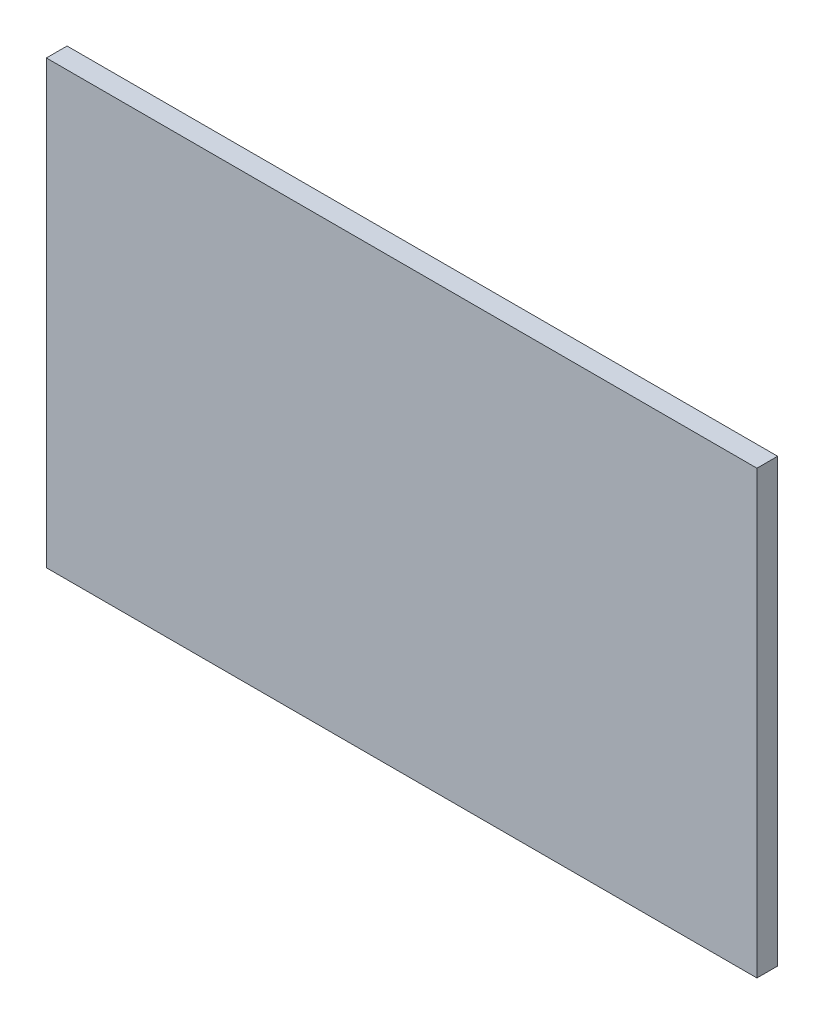
ISO-10303-21;
HEADER;
FILE_DESCRIPTION(('STEP AP214'),'2;1');
FILE_NAME('part.step','',(''),(''),'','','');
FILE_SCHEMA(('AUTOMOTIVE_DESIGN { 1 0 10303 214 1 1 1 1 }'));
ENDSEC;
DATA;
#1=APPLICATION_CONTEXT('core data for automotive mechanical design processes');
#2=APPLICATION_PROTOCOL_DEFINITION('international standard','automotive_design',2000,#1);
#3=PRODUCT_CONTEXT('',#1,'mechanical');
#4=PRODUCT('Part','Part','',(#3));
#5=PRODUCT_RELATED_PRODUCT_CATEGORY('part','',(#4));
#6=PRODUCT_DEFINITION_FORMATION('','',#4);
#7=PRODUCT_DEFINITION_CONTEXT('part definition',#1,'design');
#8=PRODUCT_DEFINITION('design','',#6,#7);
#9=PRODUCT_DEFINITION_SHAPE('','',#8);
#10=(LENGTH_UNIT() NAMED_UNIT(*) SI_UNIT(.MILLI.,.METRE.));
#11=(NAMED_UNIT(*) PLANE_ANGLE_UNIT() SI_UNIT($,.RADIAN.));
#12=(NAMED_UNIT(*) SI_UNIT($,.STERADIAN.) SOLID_ANGLE_UNIT());
#13=UNCERTAINTY_MEASURE_WITH_UNIT(LENGTH_MEASURE(1.E-05),#10,'distance_accuracy_value','');
#14=(GEOMETRIC_REPRESENTATION_CONTEXT(3) GLOBAL_UNCERTAINTY_ASSIGNED_CONTEXT((#13)) GLOBAL_UNIT_ASSIGNED_CONTEXT((#10,
#11,#12)) REPRESENTATION_CONTEXT('',''));
#15=CARTESIAN_POINT('',(0.,0.,0.));
#16=DIRECTION('',(0.,0.,1.));
#17=DIRECTION('',(1.,0.,0.));
#18=AXIS2_PLACEMENT_3D('',#15,#16,#17);
#19=CARTESIAN_POINT('',(-51.5,-32.,3.));
#20=DIRECTION('',(1.,0.,0.));
#21=DIRECTION('',(0.,1.,0.));
#22=AXIS2_PLACEMENT_3D('',#19,#20,#21);
#23=PLANE('',#22);
#24=DIRECTION('',(0.,-1.,0.));
#25=VECTOR('',#24,1.);
#26=CARTESIAN_POINT('',(-51.5,-32.,0.));
#27=LINE('',#26,#25);
#28=CARTESIAN_POINT('',(-51.5,32.,0.));
#29=VERTEX_POINT('',#28);
#30=CARTESIAN_POINT('',(-51.5,-32.,0.));
#31=VERTEX_POINT('',#30);
#32=EDGE_CURVE('E107',#29,#31,#27,.T.);
#33=ORIENTED_EDGE('',*,*,#32,.T.);
#34=DIRECTION('',(0.,0.,-1.));
#35=VECTOR('',#34,1.);
#36=CARTESIAN_POINT('',(-51.5,-32.,3.));
#37=LINE('',#36,#35);
#38=CARTESIAN_POINT('',(-51.5,-32.,3.));
#39=VERTEX_POINT('',#38);
#40=EDGE_CURVE('E11',#39,#31,#37,.T.);
#41=ORIENTED_EDGE('',*,*,#40,.F.);
#42=DIRECTION('',(0.,-1.,0.));
#43=VECTOR('',#42,1.);
#44=CARTESIAN_POINT('',(-51.5,-32.,3.));
#45=LINE('',#44,#43);
#46=CARTESIAN_POINT('',(-51.5,32.,3.));
#47=VERTEX_POINT('',#46);
#48=EDGE_CURVE('E91',#47,#39,#45,.T.);
#49=ORIENTED_EDGE('',*,*,#48,.F.);
#50=DIRECTION('',(0.,0.,-1.));
#51=VECTOR('',#50,1.);
#52=CARTESIAN_POINT('',(-51.5,32.,3.));
#53=LINE('',#52,#51);
#54=EDGE_CURVE('E103',#47,#29,#53,.T.);
#55=ORIENTED_EDGE('',*,*,#54,.T.);
#56=EDGE_LOOP('',(#33,#41,#49,#55));
#57=FACE_BOUND('',#56,.T.);
#58=ADVANCED_FACE('F39',(#57),#23,.F.);
#59=CARTESIAN_POINT('',(51.5,-32.,3.));
#60=DIRECTION('',(0.,1.,0.));
#61=DIRECTION('',(-1.,0.,0.));
#62=AXIS2_PLACEMENT_3D('',#59,#60,#61);
#63=PLANE('',#62);
#64=DIRECTION('',(1.,0.,0.));
#65=VECTOR('',#64,1.);
#66=CARTESIAN_POINT('',(51.5,-32.,0.));
#67=LINE('',#66,#65);
#68=CARTESIAN_POINT('',(51.5,-32.,0.));
#69=VERTEX_POINT('',#68);
#70=EDGE_CURVE('E96',#31,#69,#67,.T.);
#71=ORIENTED_EDGE('',*,*,#70,.T.);
#72=DIRECTION('',(0.,0.,-1.));
#73=VECTOR('',#72,1.);
#74=CARTESIAN_POINT('',(51.5,-32.,3.));
#75=LINE('',#74,#73);
#76=CARTESIAN_POINT('',(51.5,-32.,3.));
#77=VERTEX_POINT('',#76);
#78=EDGE_CURVE('E48',#77,#69,#75,.T.);
#79=ORIENTED_EDGE('',*,*,#78,.F.);
#80=DIRECTION('',(1.,0.,0.));
#81=VECTOR('',#80,1.);
#82=CARTESIAN_POINT('',(51.5,-32.,3.));
#83=LINE('',#82,#81);
#84=EDGE_CURVE('E86',#39,#77,#83,.T.);
#85=ORIENTED_EDGE('',*,*,#84,.F.);
#86=ORIENTED_EDGE('',*,*,#40,.T.);
#87=EDGE_LOOP('',(#71,#79,#85,#86));
#88=FACE_BOUND('',#87,.T.);
#89=ADVANCED_FACE('F95',(#88),#63,.F.);
#90=CARTESIAN_POINT('',(51.5,-32.,3.));
#91=DIRECTION('',(-1.,0.,0.));
#92=DIRECTION('',(0.,0.,1.));
#93=AXIS2_PLACEMENT_3D('',#90,#91,#92);
#94=PLANE('',#93);
#95=DIRECTION('',(0.,1.,0.));
#96=VECTOR('',#95,1.);
#97=CARTESIAN_POINT('',(51.5,-32.,0.));
#98=LINE('',#97,#96);
#99=CARTESIAN_POINT('',(51.5,32.,0.));
#100=VERTEX_POINT('',#99);
#101=EDGE_CURVE('E73',#69,#100,#98,.T.);
#102=ORIENTED_EDGE('',*,*,#101,.T.);
#103=DIRECTION('',(0.,0.,-1.));
#104=VECTOR('',#103,1.);
#105=CARTESIAN_POINT('',(51.5,32.,3.));
#106=LINE('',#105,#104);
#107=CARTESIAN_POINT('',(51.5,32.,3.));
#108=VERTEX_POINT('',#107);
#109=EDGE_CURVE('E98',#108,#100,#106,.T.);
#110=ORIENTED_EDGE('',*,*,#109,.F.);
#111=DIRECTION('',(0.,1.,0.));
#112=VECTOR('',#111,1.);
#113=CARTESIAN_POINT('',(51.5,-32.,3.));
#114=LINE('',#113,#112);
#115=EDGE_CURVE('E89',#77,#108,#114,.T.);
#116=ORIENTED_EDGE('',*,*,#115,.F.);
#117=ORIENTED_EDGE('',*,*,#78,.T.);
#118=EDGE_LOOP('',(#102,#110,#116,#117));
#119=FACE_BOUND('',#118,.T.);
#120=ADVANCED_FACE('F99',(#119),#94,.F.);
#121=CARTESIAN_POINT('',(51.5,32.,3.));
#122=DIRECTION('',(0.,-1.,0.));
#123=DIRECTION('',(1.,0.,0.));
#124=AXIS2_PLACEMENT_3D('',#121,#122,#123);
#125=PLANE('',#124);
#126=DIRECTION('',(-1.,0.,0.));
#127=VECTOR('',#126,1.);
#128=CARTESIAN_POINT('',(51.5,32.,0.));
#129=LINE('',#128,#127);
#130=EDGE_CURVE('E79',#100,#29,#129,.T.);
#131=ORIENTED_EDGE('',*,*,#130,.T.);
#132=ORIENTED_EDGE('',*,*,#54,.F.);
#133=DIRECTION('',(-1.,0.,0.));
#134=VECTOR('',#133,1.);
#135=CARTESIAN_POINT('',(51.5,32.,3.));
#136=LINE('',#135,#134);
#137=EDGE_CURVE('E56',#108,#47,#136,.T.);
#138=ORIENTED_EDGE('',*,*,#137,.F.);
#139=ORIENTED_EDGE('',*,*,#109,.T.);
#140=EDGE_LOOP('',(#131,#132,#138,#139));
#141=FACE_BOUND('',#140,.T.);
#142=ADVANCED_FACE('F120',(#141),#125,.F.);
#143=CARTESIAN_POINT('',(0.,0.,3.));
#144=DIRECTION('',(0.,0.,1.));
#145=DIRECTION('',(1.,0.,0.));
#146=AXIS2_PLACEMENT_3D('',#143,#144,#145);
#147=PLANE('',#146);
#148=ORIENTED_EDGE('',*,*,#48,.T.);
#149=ORIENTED_EDGE('',*,*,#84,.T.);
#150=ORIENTED_EDGE('',*,*,#115,.T.);
#151=ORIENTED_EDGE('',*,*,#137,.T.);
#152=EDGE_LOOP('',(#148,#149,#150,#151));
#153=FACE_BOUND('',#152,.T.);
#154=ADVANCED_FACE('F87',(#153),#147,.T.);
#155=CARTESIAN_POINT('',(0.,0.,0.));
#156=DIRECTION('',(0.,0.,1.));
#157=DIRECTION('',(1.,0.,0.));
#158=AXIS2_PLACEMENT_3D('',#155,#156,#157);
#159=PLANE('',#158);
#160=ORIENTED_EDGE('',*,*,#32,.F.);
#161=ORIENTED_EDGE('',*,*,#130,.F.);
#162=ORIENTED_EDGE('',*,*,#101,.F.);
#163=ORIENTED_EDGE('',*,*,#70,.F.);
#164=EDGE_LOOP('',(#160,#161,#162,#163));
#165=FACE_BOUND('',#164,.T.);
#166=ADVANCED_FACE('F123',(#165),#159,.F.);
#167=CLOSED_SHELL('',(#58,#89,#120,#142,#154,#166));
#168=MANIFOLD_SOLID_BREP('B2',#167);
#169=ADVANCED_BREP_SHAPE_REPRESENTATION('',(#18,#168),#14);
#170=SHAPE_DEFINITION_REPRESENTATION(#9,#169);
ENDSEC;
END-ISO-10303-21;
